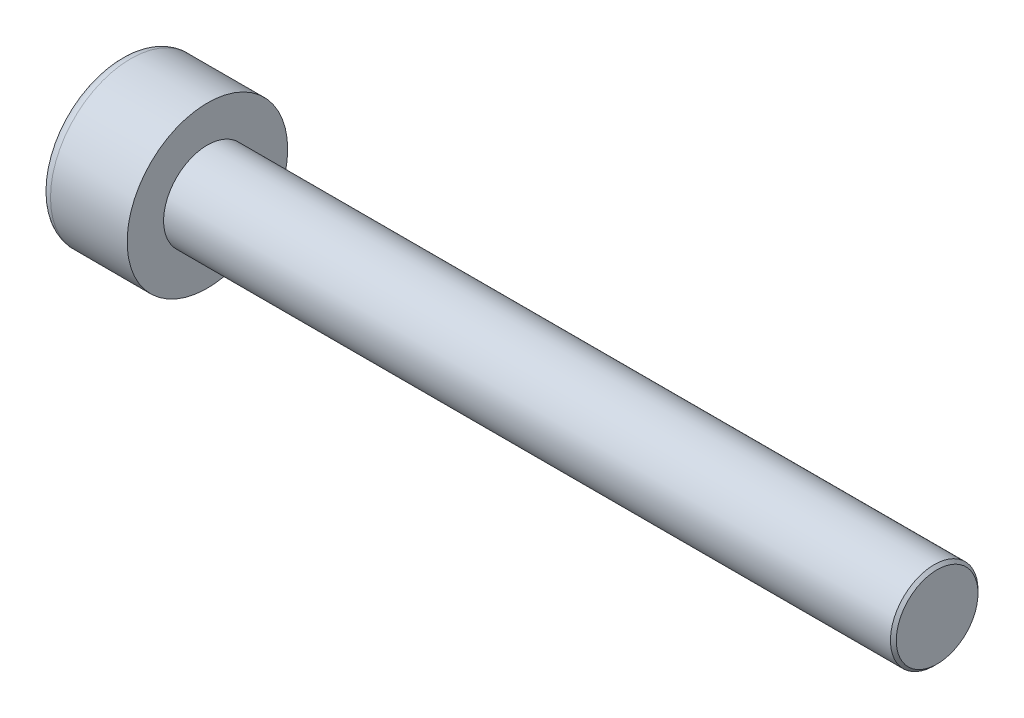
ISO-10303-21;
HEADER;
FILE_DESCRIPTION(('STEP AP214'),'2;1');
FILE_NAME('part.step','',(''),(''),'','','');
FILE_SCHEMA(('AUTOMOTIVE_DESIGN { 1 0 10303 214 1 1 1 1 }'));
ENDSEC;
DATA;
#1=APPLICATION_CONTEXT('core data for automotive mechanical design processes');
#2=APPLICATION_PROTOCOL_DEFINITION('international standard','automotive_design',2000,#1);
#3=PRODUCT_CONTEXT('',#1,'mechanical');
#4=PRODUCT('Part','Part','',(#3));
#5=PRODUCT_RELATED_PRODUCT_CATEGORY('part','',(#4));
#6=PRODUCT_DEFINITION_FORMATION('','',#4);
#7=PRODUCT_DEFINITION_CONTEXT('part definition',#1,'design');
#8=PRODUCT_DEFINITION('design','',#6,#7);
#9=PRODUCT_DEFINITION_SHAPE('','',#8);
#10=(LENGTH_UNIT() NAMED_UNIT(*) SI_UNIT(.MILLI.,.METRE.));
#11=(NAMED_UNIT(*) PLANE_ANGLE_UNIT() SI_UNIT($,.RADIAN.));
#12=(NAMED_UNIT(*) SI_UNIT($,.STERADIAN.) SOLID_ANGLE_UNIT());
#13=UNCERTAINTY_MEASURE_WITH_UNIT(LENGTH_MEASURE(1.E-05),#10,'distance_accuracy_value','');
#14=(GEOMETRIC_REPRESENTATION_CONTEXT(3) GLOBAL_UNCERTAINTY_ASSIGNED_CONTEXT((#13)) GLOBAL_UNIT_ASSIGNED_CONTEXT((#10,
#11,#12)) REPRESENTATION_CONTEXT('',''));
#15=CARTESIAN_POINT('',(0.,0.,0.));
#16=DIRECTION('',(0.,0.,1.));
#17=DIRECTION('',(1.,0.,0.));
#18=AXIS2_PLACEMENT_3D('',#15,#16,#17);
#19=CARTESIAN_POINT('',(1.3,-1.25,0.721687836487031));
#20=DIRECTION('',(0.,1.,0.));
#21=DIRECTION('',(1.,0.,0.));
#22=AXIS2_PLACEMENT_3D('',#19,#20,#21);
#23=PLANE('',#22);
#24=DIRECTION('',(0.,0.,-1.));
#25=VECTOR('',#24,1.);
#26=CARTESIAN_POINT('',(0.,-1.25,0.721687836487031));
#27=LINE('',#26,#25);
#28=CARTESIAN_POINT('',(0.,-1.25,0.721687836487031));
#29=VERTEX_POINT('',#28);
#30=CARTESIAN_POINT('',(0.,-1.25,-0.721687836487035));
#31=VERTEX_POINT('',#30);
#32=EDGE_CURVE('E280',#29,#31,#27,.T.);
#33=ORIENTED_EDGE('',*,*,#32,.F.);
#34=DIRECTION('',(-1.,0.,0.));
#35=VECTOR('',#34,1.);
#36=CARTESIAN_POINT('',(1.3,-1.25,0.721687836487031));
#37=LINE('',#36,#35);
#38=CARTESIAN_POINT('',(1.3,-1.25,0.721687836487031));
#39=VERTEX_POINT('',#38);
#40=EDGE_CURVE('E11',#39,#29,#37,.T.);
#41=ORIENTED_EDGE('',*,*,#40,.F.);
#42=DIRECTION('',(0.,0.,-1.));
#43=VECTOR('',#42,1.);
#44=CARTESIAN_POINT('',(1.3,-1.25,0.721687836487031));
#45=LINE('',#44,#43);
#46=CARTESIAN_POINT('',(1.3,-1.25,0.));
#47=VERTEX_POINT('',#46);
#48=EDGE_CURVE('E202',#39,#47,#45,.T.);
#49=ORIENTED_EDGE('',*,*,#48,.T.);
#50=DIRECTION('',(0.,0.,-1.));
#51=VECTOR('',#50,1.);
#52=CARTESIAN_POINT('',(1.3,-1.25,0.721687836487031));
#53=LINE('',#52,#51);
#54=CARTESIAN_POINT('',(1.3,-1.25,-0.721687836487035));
#55=VERTEX_POINT('',#54);
#56=EDGE_CURVE('E164',#47,#55,#53,.T.);
#57=ORIENTED_EDGE('',*,*,#56,.T.);
#58=DIRECTION('',(-1.,0.,0.));
#59=VECTOR('',#58,1.);
#60=CARTESIAN_POINT('',(1.3,-1.25,-0.721687836487035));
#61=LINE('',#60,#59);
#62=EDGE_CURVE('E160',#55,#31,#61,.T.);
#63=ORIENTED_EDGE('',*,*,#62,.T.);
#64=EDGE_LOOP('',(#33,#41,#49,#57,#63));
#65=FACE_BOUND('',#64,.T.);
#66=ADVANCED_FACE('F17',(#65),#23,.T.);
#67=CARTESIAN_POINT('',(1.3,0.,1.44337567297406));
#68=DIRECTION('',(0.,0.5,-0.866025403784439));
#69=DIRECTION('',(-1.,0.,0.));
#70=AXIS2_PLACEMENT_3D('',#67,#68,#69);
#71=PLANE('',#70);
#72=DIRECTION('',(0.,-0.866025403784439,-0.5));
#73=VECTOR('',#72,1.);
#74=CARTESIAN_POINT('',(0.,0.,1.44337567297406));
#75=LINE('',#74,#73);
#76=CARTESIAN_POINT('',(0.,0.,1.44337567297406));
#77=VERTEX_POINT('',#76);
#78=EDGE_CURVE('E272',#77,#29,#75,.T.);
#79=ORIENTED_EDGE('',*,*,#78,.F.);
#80=DIRECTION('',(-1.,0.,0.));
#81=VECTOR('',#80,1.);
#82=CARTESIAN_POINT('',(1.3,0.,1.44337567297406));
#83=LINE('',#82,#81);
#84=CARTESIAN_POINT('',(1.3,0.,1.44337567297406));
#85=VERTEX_POINT('',#84);
#86=EDGE_CURVE('E28',#85,#77,#83,.T.);
#87=ORIENTED_EDGE('',*,*,#86,.F.);
#88=DIRECTION('',(0.,-0.866025403784439,-0.5));
#89=VECTOR('',#88,1.);
#90=CARTESIAN_POINT('',(1.3,0.,1.44337567297406));
#91=LINE('',#90,#89);
#92=CARTESIAN_POINT('',(1.3,-0.625,1.08253175473055));
#93=VERTEX_POINT('',#92);
#94=EDGE_CURVE('E193',#85,#93,#91,.T.);
#95=ORIENTED_EDGE('',*,*,#94,.T.);
#96=DIRECTION('',(0.,-0.866025403784439,-0.5));
#97=VECTOR('',#96,1.);
#98=CARTESIAN_POINT('',(1.3,0.,1.44337567297406));
#99=LINE('',#98,#97);
#100=EDGE_CURVE('E205',#93,#39,#99,.T.);
#101=ORIENTED_EDGE('',*,*,#100,.T.);
#102=ORIENTED_EDGE('',*,*,#40,.T.);
#103=EDGE_LOOP('',(#79,#87,#95,#101,#102));
#104=FACE_BOUND('',#103,.T.);
#105=ADVANCED_FACE('F345',(#104),#71,.T.);
#106=CARTESIAN_POINT('',(1.3,1.25,0.721687836487032));
#107=DIRECTION('',(0.,-0.5,-0.866025403784439));
#108=DIRECTION('',(0.,-0.866025403784439,0.5));
#109=AXIS2_PLACEMENT_3D('',#106,#107,#108);
#110=PLANE('',#109);
#111=DIRECTION('',(0.,-0.866025403784439,0.5));
#112=VECTOR('',#111,1.);
#113=CARTESIAN_POINT('',(0.,1.25,0.721687836487032));
#114=LINE('',#113,#112);
#115=CARTESIAN_POINT('',(0.,1.25,0.721687836487032));
#116=VERTEX_POINT('',#115);
#117=EDGE_CURVE('E268',#116,#77,#114,.T.);
#118=ORIENTED_EDGE('',*,*,#117,.F.);
#119=DIRECTION('',(-1.,0.,0.));
#120=VECTOR('',#119,1.);
#121=CARTESIAN_POINT('',(1.3,1.25,0.721687836487032));
#122=LINE('',#121,#120);
#123=CARTESIAN_POINT('',(1.3,1.25,0.721687836487032));
#124=VERTEX_POINT('',#123);
#125=EDGE_CURVE('E198',#124,#116,#122,.T.);
#126=ORIENTED_EDGE('',*,*,#125,.F.);
#127=DIRECTION('',(0.,-0.866025403784439,0.5));
#128=VECTOR('',#127,1.);
#129=CARTESIAN_POINT('',(1.3,1.25,0.721687836487032));
#130=LINE('',#129,#128);
#131=CARTESIAN_POINT('',(1.3,0.625,1.08253175473055));
#132=VERTEX_POINT('',#131);
#133=EDGE_CURVE('E239',#124,#132,#130,.T.);
#134=ORIENTED_EDGE('',*,*,#133,.T.);
#135=DIRECTION('',(0.,-0.866025403784439,0.5));
#136=VECTOR('',#135,1.);
#137=CARTESIAN_POINT('',(1.3,1.25,0.721687836487032));
#138=LINE('',#137,#136);
#139=EDGE_CURVE('E197',#132,#85,#138,.T.);
#140=ORIENTED_EDGE('',*,*,#139,.T.);
#141=ORIENTED_EDGE('',*,*,#86,.T.);
#142=EDGE_LOOP('',(#118,#126,#134,#140,#141));
#143=FACE_BOUND('',#142,.T.);
#144=ADVANCED_FACE('F343',(#143),#110,.T.);
#145=CARTESIAN_POINT('',(1.3,1.25,-0.721687836487031));
#146=DIRECTION('',(0.,-1.,0.));
#147=DIRECTION('',(0.,0.,-1.));
#148=AXIS2_PLACEMENT_3D('',#145,#146,#147);
#149=PLANE('',#148);
#150=DIRECTION('',(0.,0.,1.));
#151=VECTOR('',#150,1.);
#152=CARTESIAN_POINT('',(0.,1.25,-0.721687836487031));
#153=LINE('',#152,#151);
#154=CARTESIAN_POINT('',(0.,1.25,-0.721687836487031));
#155=VERTEX_POINT('',#154);
#156=EDGE_CURVE('E250',#155,#116,#153,.T.);
#157=ORIENTED_EDGE('',*,*,#156,.F.);
#158=DIRECTION('',(-1.,0.,0.));
#159=VECTOR('',#158,1.);
#160=CARTESIAN_POINT('',(1.3,1.25,-0.721687836487031));
#161=LINE('',#160,#159);
#162=CARTESIAN_POINT('',(1.3,1.25,-0.721687836487031));
#163=VERTEX_POINT('',#162);
#164=EDGE_CURVE('E201',#163,#155,#161,.T.);
#165=ORIENTED_EDGE('',*,*,#164,.F.);
#166=DIRECTION('',(0.,0.,1.));
#167=VECTOR('',#166,1.);
#168=CARTESIAN_POINT('',(1.3,1.25,-0.721687836487031));
#169=LINE('',#168,#167);
#170=CARTESIAN_POINT('',(1.3,1.25,0.));
#171=VERTEX_POINT('',#170);
#172=EDGE_CURVE('E192',#163,#171,#169,.T.);
#173=ORIENTED_EDGE('',*,*,#172,.T.);
#174=DIRECTION('',(0.,0.,1.));
#175=VECTOR('',#174,1.);
#176=CARTESIAN_POINT('',(1.3,1.25,-0.721687836487031));
#177=LINE('',#176,#175);
#178=EDGE_CURVE('E242',#171,#124,#177,.T.);
#179=ORIENTED_EDGE('',*,*,#178,.T.);
#180=ORIENTED_EDGE('',*,*,#125,.T.);
#181=EDGE_LOOP('',(#157,#165,#173,#179,#180));
#182=FACE_BOUND('',#181,.T.);
#183=ADVANCED_FACE('F318',(#182),#149,.T.);
#184=CARTESIAN_POINT('',(1.3,0.,-1.44337567297406));
#185=DIRECTION('',(0.,-0.5,0.866025403784439));
#186=DIRECTION('',(-1.,0.,0.));
#187=AXIS2_PLACEMENT_3D('',#184,#185,#186);
#188=PLANE('',#187);
#189=DIRECTION('',(0.,0.866025403784439,0.5));
#190=VECTOR('',#189,1.);
#191=CARTESIAN_POINT('',(0.,0.,-1.44337567297406));
#192=LINE('',#191,#190);
#193=CARTESIAN_POINT('',(0.,0.,-1.44337567297406));
#194=VERTEX_POINT('',#193);
#195=EDGE_CURVE('E246',#194,#155,#192,.T.);
#196=ORIENTED_EDGE('',*,*,#195,.F.);
#197=DIRECTION('',(-1.,0.,0.));
#198=VECTOR('',#197,1.);
#199=CARTESIAN_POINT('',(1.3,0.,-1.44337567297406));
#200=LINE('',#199,#198);
#201=CARTESIAN_POINT('',(1.3,0.,-1.44337567297406));
#202=VERTEX_POINT('',#201);
#203=EDGE_CURVE('E326',#202,#194,#200,.T.);
#204=ORIENTED_EDGE('',*,*,#203,.F.);
#205=DIRECTION('',(0.,0.866025403784439,0.5));
#206=VECTOR('',#205,1.);
#207=CARTESIAN_POINT('',(1.3,0.,-1.44337567297406));
#208=LINE('',#207,#206);
#209=CARTESIAN_POINT('',(1.3,0.625,-1.08253175473055));
#210=VERTEX_POINT('',#209);
#211=EDGE_CURVE('E151',#202,#210,#208,.T.);
#212=ORIENTED_EDGE('',*,*,#211,.T.);
#213=DIRECTION('',(0.,0.866025403784439,0.5));
#214=VECTOR('',#213,1.);
#215=CARTESIAN_POINT('',(1.3,0.,-1.44337567297406));
#216=LINE('',#215,#214);
#217=EDGE_CURVE('E189',#210,#163,#216,.T.);
#218=ORIENTED_EDGE('',*,*,#217,.T.);
#219=ORIENTED_EDGE('',*,*,#164,.T.);
#220=EDGE_LOOP('',(#196,#204,#212,#218,#219));
#221=FACE_BOUND('',#220,.T.);
#222=ADVANCED_FACE('F351',(#221),#188,.T.);
#223=CARTESIAN_POINT('',(1.3,-1.25,-0.721687836487035));
#224=DIRECTION('',(0.,0.5,0.866025403784439));
#225=DIRECTION('',(1.,0.,0.));
#226=AXIS2_PLACEMENT_3D('',#223,#224,#225);
#227=PLANE('',#226);
#228=DIRECTION('',(0.,0.866025403784439,-0.5));
#229=VECTOR('',#228,1.);
#230=CARTESIAN_POINT('',(0.,-1.25,-0.721687836487035));
#231=LINE('',#230,#229);
#232=EDGE_CURVE('E196',#31,#194,#231,.T.);
#233=ORIENTED_EDGE('',*,*,#232,.F.);
#234=ORIENTED_EDGE('',*,*,#62,.F.);
#235=DIRECTION('',(0.,0.866025403784439,-0.5));
#236=VECTOR('',#235,1.);
#237=CARTESIAN_POINT('',(1.3,-1.25,-0.721687836487035));
#238=LINE('',#237,#236);
#239=CARTESIAN_POINT('',(1.3,-0.625,-1.08253175473055));
#240=VERTEX_POINT('',#239);
#241=EDGE_CURVE('E154',#55,#240,#238,.T.);
#242=ORIENTED_EDGE('',*,*,#241,.T.);
#243=DIRECTION('',(0.,0.866025403784439,-0.5));
#244=VECTOR('',#243,1.);
#245=CARTESIAN_POINT('',(1.3,-1.25,-0.721687836487035));
#246=LINE('',#245,#244);
#247=EDGE_CURVE('E143',#240,#202,#246,.T.);
#248=ORIENTED_EDGE('',*,*,#247,.T.);
#249=ORIENTED_EDGE('',*,*,#203,.T.);
#250=EDGE_LOOP('',(#233,#234,#242,#248,#249));
#251=FACE_BOUND('',#250,.T.);
#252=ADVANCED_FACE('F159',(#251),#227,.T.);
#253=CARTESIAN_POINT('',(28.,0.,0.));
#254=DIRECTION('',(1.,0.,0.));
#255=DIRECTION('',(0.,1.,0.));
#256=AXIS2_PLACEMENT_3D('',#253,#254,#255);
#257=PLANE('',#256);
#258=CARTESIAN_POINT('',(28.,0.,0.));
#259=DIRECTION('',(1.,0.,0.));
#260=DIRECTION('',(0.,0.,-1.));
#261=AXIS2_PLACEMENT_3D('',#258,#259,#260);
#262=CIRCLE('',#261,1.4);
#263=CARTESIAN_POINT('',(28.,0.,-1.4));
#264=VERTEX_POINT('',#263);
#265=EDGE_CURVE('E215',#264,#264,#262,.T.);
#266=ORIENTED_EDGE('',*,*,#265,.T.);
#267=EDGE_LOOP('',(#266));
#268=FACE_BOUND('',#267,.T.);
#269=ADVANCED_FACE('F359',(#268),#257,.T.);
#270=CARTESIAN_POINT('',(3.,0.,0.));
#271=DIRECTION('',(1.,0.,0.));
#272=DIRECTION('',(0.,1.,0.));
#273=AXIS2_PLACEMENT_3D('',#270,#271,#272);
#274=PLANE('',#273);
#275=CARTESIAN_POINT('',(3.,0.,0.));
#276=DIRECTION('',(1.,0.,0.));
#277=DIRECTION('',(0.,0.,-1.));
#278=AXIS2_PLACEMENT_3D('',#275,#276,#277);
#279=CIRCLE('',#278,1.5);
#280=CARTESIAN_POINT('',(3.,0.,-1.5));
#281=VERTEX_POINT('',#280);
#282=EDGE_CURVE('E251',#281,#281,#279,.T.);
#283=ORIENTED_EDGE('',*,*,#282,.F.);
#284=EDGE_LOOP('',(#283));
#285=FACE_BOUND('',#284,.T.);
#286=CARTESIAN_POINT('',(3.,0.,0.));
#287=DIRECTION('',(1.,0.,0.));
#288=DIRECTION('',(0.,0.,-1.));
#289=AXIS2_PLACEMENT_3D('',#286,#287,#288);
#290=CIRCLE('',#289,2.75);
#291=CARTESIAN_POINT('',(3.,0.,-2.75));
#292=VERTEX_POINT('',#291);
#293=EDGE_CURVE('E209',#292,#292,#290,.T.);
#294=ORIENTED_EDGE('',*,*,#293,.T.);
#295=EDGE_LOOP('',(#294));
#296=FACE_BOUND('',#295,.T.);
#297=ADVANCED_FACE('F384',(#285,#296),#274,.T.);
#298=CARTESIAN_POINT('',(0.,0.,0.));
#299=DIRECTION('',(1.,0.,0.));
#300=DIRECTION('',(0.,1.,0.));
#301=AXIS2_PLACEMENT_3D('',#298,#299,#300);
#302=PLANE('',#301);
#303=ORIENTED_EDGE('',*,*,#232,.T.);
#304=ORIENTED_EDGE('',*,*,#195,.T.);
#305=ORIENTED_EDGE('',*,*,#156,.T.);
#306=ORIENTED_EDGE('',*,*,#117,.T.);
#307=ORIENTED_EDGE('',*,*,#78,.T.);
#308=ORIENTED_EDGE('',*,*,#32,.T.);
#309=EDGE_LOOP('',(#303,#304,#305,#306,#307,#308));
#310=FACE_BOUND('',#309,.T.);
#311=CARTESIAN_POINT('',(0.,0.,0.));
#312=DIRECTION('',(-1.,0.,0.));
#313=DIRECTION('',(0.,0.,-1.));
#314=AXIS2_PLACEMENT_3D('',#311,#312,#313);
#315=CIRCLE('',#314,2.375);
#316=CARTESIAN_POINT('',(0.,0.,2.375));
#317=VERTEX_POINT('',#316);
#318=EDGE_CURVE('E184',#317,#317,#315,.T.);
#319=ORIENTED_EDGE('',*,*,#318,.T.);
#320=EDGE_LOOP('',(#319));
#321=FACE_BOUND('',#320,.T.);
#322=ADVANCED_FACE('F349',(#310,#321),#302,.F.);
#323=CARTESIAN_POINT('',(1.3,-2.5,0.));
#324=DIRECTION('',(-1.,0.,0.));
#325=DIRECTION('',(0.,0.,1.));
#326=AXIS2_PLACEMENT_3D('',#323,#324,#325);
#327=PLANE('',#326);
#328=ORIENTED_EDGE('',*,*,#139,.F.);
#329=CARTESIAN_POINT('',(1.3,0.,0.));
#330=DIRECTION('',(1.,0.,0.));
#331=DIRECTION('',(0.,0.,1.));
#332=AXIS2_PLACEMENT_3D('',#329,#330,#331);
#333=CIRCLE('',#332,1.25);
#334=EDGE_CURVE('E260',#132,#93,#333,.T.);
#335=ORIENTED_EDGE('',*,*,#334,.T.);
#336=ORIENTED_EDGE('',*,*,#94,.F.);
#337=EDGE_LOOP('',(#328,#335,#336));
#338=FACE_BOUND('',#337,.T.);
#339=ADVANCED_FACE('F344',(#338),#327,.T.);
#340=CARTESIAN_POINT('',(1.3,-2.5,0.));
#341=DIRECTION('',(-1.,0.,0.));
#342=DIRECTION('',(0.,0.,1.));
#343=AXIS2_PLACEMENT_3D('',#340,#341,#342);
#344=PLANE('',#343);
#345=ORIENTED_EDGE('',*,*,#178,.F.);
#346=CARTESIAN_POINT('',(1.3,0.,0.));
#347=DIRECTION('',(1.,0.,0.));
#348=DIRECTION('',(0.,0.,1.));
#349=AXIS2_PLACEMENT_3D('',#346,#347,#348);
#350=CIRCLE('',#349,1.25);
#351=EDGE_CURVE('E256',#171,#132,#350,.T.);
#352=ORIENTED_EDGE('',*,*,#351,.T.);
#353=ORIENTED_EDGE('',*,*,#133,.F.);
#354=EDGE_LOOP('',(#345,#352,#353));
#355=FACE_BOUND('',#354,.T.);
#356=ADVANCED_FACE('F312',(#355),#344,.T.);
#357=CARTESIAN_POINT('',(1.3,-2.5,0.));
#358=DIRECTION('',(-1.,0.,0.));
#359=DIRECTION('',(0.,0.,1.));
#360=AXIS2_PLACEMENT_3D('',#357,#358,#359);
#361=PLANE('',#360);
#362=ORIENTED_EDGE('',*,*,#217,.F.);
#363=CARTESIAN_POINT('',(1.3,0.,0.));
#364=DIRECTION('',(1.,0.,0.));
#365=DIRECTION('',(0.,0.,-1.));
#366=AXIS2_PLACEMENT_3D('',#363,#364,#365);
#367=CIRCLE('',#366,1.25);
#368=EDGE_CURVE('E21',#210,#171,#367,.T.);
#369=ORIENTED_EDGE('',*,*,#368,.T.);
#370=ORIENTED_EDGE('',*,*,#172,.F.);
#371=EDGE_LOOP('',(#362,#369,#370));
#372=FACE_BOUND('',#371,.T.);
#373=ADVANCED_FACE('F308',(#372),#361,.T.);
#374=CARTESIAN_POINT('',(1.3,-2.5,0.));
#375=DIRECTION('',(-1.,0.,0.));
#376=DIRECTION('',(0.,0.,1.));
#377=AXIS2_PLACEMENT_3D('',#374,#375,#376);
#378=PLANE('',#377);
#379=ORIENTED_EDGE('',*,*,#247,.F.);
#380=CARTESIAN_POINT('',(1.3,0.,0.));
#381=DIRECTION('',(1.,0.,0.));
#382=DIRECTION('',(0.,0.,1.));
#383=AXIS2_PLACEMENT_3D('',#380,#381,#382);
#384=CIRCLE('',#383,1.25);
#385=CARTESIAN_POINT('',(1.3,0.,-1.25));
#386=VERTEX_POINT('',#385);
#387=EDGE_CURVE('E148',#240,#386,#384,.T.);
#388=ORIENTED_EDGE('',*,*,#387,.T.);
#389=CARTESIAN_POINT('',(1.3,0.,0.));
#390=DIRECTION('',(1.,0.,0.));
#391=DIRECTION('',(0.,0.,1.));
#392=AXIS2_PLACEMENT_3D('',#389,#390,#391);
#393=CIRCLE('',#392,1.25);
#394=EDGE_CURVE('E254',#386,#210,#393,.T.);
#395=ORIENTED_EDGE('',*,*,#394,.T.);
#396=ORIENTED_EDGE('',*,*,#211,.F.);
#397=EDGE_LOOP('',(#379,#388,#395,#396));
#398=FACE_BOUND('',#397,.T.);
#399=ADVANCED_FACE('F145',(#398),#378,.T.);
#400=CARTESIAN_POINT('',(1.3,-2.5,0.));
#401=DIRECTION('',(-1.,0.,0.));
#402=DIRECTION('',(0.,0.,1.));
#403=AXIS2_PLACEMENT_3D('',#400,#401,#402);
#404=PLANE('',#403);
#405=ORIENTED_EDGE('',*,*,#56,.F.);
#406=CARTESIAN_POINT('',(1.3,0.,0.));
#407=DIRECTION('',(1.,0.,0.));
#408=DIRECTION('',(0.,0.,1.));
#409=AXIS2_PLACEMENT_3D('',#406,#407,#408);
#410=CIRCLE('',#409,1.25);
#411=EDGE_CURVE('E167',#47,#240,#410,.T.);
#412=ORIENTED_EDGE('',*,*,#411,.T.);
#413=ORIENTED_EDGE('',*,*,#241,.F.);
#414=EDGE_LOOP('',(#405,#412,#413));
#415=FACE_BOUND('',#414,.T.);
#416=ADVANCED_FACE('F168',(#415),#404,.T.);
#417=CARTESIAN_POINT('',(1.3,-2.5,0.));
#418=DIRECTION('',(-1.,0.,0.));
#419=DIRECTION('',(0.,0.,1.));
#420=AXIS2_PLACEMENT_3D('',#417,#418,#419);
#421=PLANE('',#420);
#422=ORIENTED_EDGE('',*,*,#100,.F.);
#423=CARTESIAN_POINT('',(1.3,0.,0.));
#424=DIRECTION('',(1.,0.,0.));
#425=DIRECTION('',(0.,0.,1.));
#426=AXIS2_PLACEMENT_3D('',#423,#424,#425);
#427=CIRCLE('',#426,1.25);
#428=EDGE_CURVE('E173',#93,#47,#427,.T.);
#429=ORIENTED_EDGE('',*,*,#428,.T.);
#430=ORIENTED_EDGE('',*,*,#48,.F.);
#431=EDGE_LOOP('',(#422,#429,#430));
#432=FACE_BOUND('',#431,.T.);
#433=ADVANCED_FACE('F346',(#432),#421,.T.);
#434=CARTESIAN_POINT('',(3.,0.,0.));
#435=DIRECTION('',(-1.,0.,0.));
#436=DIRECTION('',(0.,0.,1.));
#437=AXIS2_PLACEMENT_3D('',#434,#435,#436);
#438=CYLINDRICAL_SURFACE('',#437,2.75);
#439=CARTESIAN_POINT('',(0.375,0.,0.));
#440=DIRECTION('',(1.,0.,0.));
#441=DIRECTION('',(0.,0.,-1.));
#442=AXIS2_PLACEMENT_3D('',#439,#440,#441);
#443=CIRCLE('',#442,2.75);
#444=CARTESIAN_POINT('',(0.375,0.,-2.75));
#445=VERTEX_POINT('',#444);
#446=CARTESIAN_POINT('',(0.375,0.,2.75));
#447=VERTEX_POINT('',#446);
#448=EDGE_CURVE('E211',#445,#447,#443,.T.);
#449=ORIENTED_EDGE('',*,*,#448,.T.);
#450=CARTESIAN_POINT('',(0.375,0.,0.));
#451=DIRECTION('',(1.,0.,0.));
#452=DIRECTION('',(0.,0.,-1.));
#453=AXIS2_PLACEMENT_3D('',#450,#451,#452);
#454=CIRCLE('',#453,2.75);
#455=EDGE_CURVE('E214',#447,#445,#454,.T.);
#456=ORIENTED_EDGE('',*,*,#455,.T.);
#457=DIRECTION('',(1.,0.,0.));
#458=VECTOR('',#457,1.);
#459=CARTESIAN_POINT('',(3.,0.,-2.75));
#460=LINE('',#459,#458);
#461=EDGE_CURVE('E206',#445,#292,#460,.T.);
#462=ORIENTED_EDGE('',*,*,#461,.T.);
#463=ORIENTED_EDGE('',*,*,#293,.F.);
#464=ORIENTED_EDGE('',*,*,#461,.F.);
#465=EDGE_LOOP('',(#449,#456,#462,#463,#464));
#466=FACE_BOUND('',#465,.T.);
#467=ADVANCED_FACE('F395',(#466),#438,.T.);
#468=CARTESIAN_POINT('',(11.,0.,0.));
#469=DIRECTION('',(-1.,0.,0.));
#470=DIRECTION('',(0.,0.,1.));
#471=AXIS2_PLACEMENT_3D('',#468,#469,#470);
#472=CYLINDRICAL_SURFACE('',#471,1.5);
#473=ORIENTED_EDGE('',*,*,#282,.T.);
#474=DIRECTION('',(1.,0.,0.));
#475=VECTOR('',#474,1.);
#476=CARTESIAN_POINT('',(11.,0.,-1.5));
#477=LINE('',#476,#475);
#478=CARTESIAN_POINT('',(27.9,0.,-1.5));
#479=VERTEX_POINT('',#478);
#480=EDGE_CURVE('E210',#281,#479,#477,.T.);
#481=ORIENTED_EDGE('',*,*,#480,.T.);
#482=CARTESIAN_POINT('',(27.9,0.,0.));
#483=DIRECTION('',(-1.,0.,0.));
#484=DIRECTION('',(0.,0.,-1.));
#485=AXIS2_PLACEMENT_3D('',#482,#483,#484);
#486=CIRCLE('',#485,1.5);
#487=EDGE_CURVE('E234',#479,#479,#486,.T.);
#488=ORIENTED_EDGE('',*,*,#487,.T.);
#489=ORIENTED_EDGE('',*,*,#480,.F.);
#490=EDGE_LOOP('',(#473,#481,#488,#489));
#491=FACE_BOUND('',#490,.T.);
#492=ADVANCED_FACE('F392',(#491),#472,.T.);
#493=CARTESIAN_POINT('',(1.3,0.,0.));
#494=DIRECTION('',(-1.,0.,0.));
#495=DIRECTION('',(0.,0.,1.));
#496=AXIS2_PLACEMENT_3D('',#493,#494,#495);
#497=CONICAL_SURFACE('',#496,1.25,1.0471975511966);
#498=DIRECTION('',(-0.5,0.,-0.866025403784438));
#499=VECTOR('',#498,1.);
#500=CARTESIAN_POINT('',(1.3,0.,-1.25));
#501=LINE('',#500,#499);
#502=CARTESIAN_POINT('',(2.02168783648704,0.,0.));
#503=VERTEX_POINT('',#502);
#504=EDGE_CURVE('E177',#503,#386,#501,.T.);
#505=ORIENTED_EDGE('',*,*,#504,.T.);
#506=ORIENTED_EDGE('',*,*,#387,.F.);
#507=ORIENTED_EDGE('',*,*,#411,.F.);
#508=ORIENTED_EDGE('',*,*,#428,.F.);
#509=ORIENTED_EDGE('',*,*,#334,.F.);
#510=ORIENTED_EDGE('',*,*,#351,.F.);
#511=ORIENTED_EDGE('',*,*,#368,.F.);
#512=ORIENTED_EDGE('',*,*,#394,.F.);
#513=ORIENTED_EDGE('',*,*,#504,.F.);
#514=EDGE_LOOP('',(#505,#506,#507,#508,#509,#510,#511,#512,#513));
#515=FACE_BOUND('',#514,.T.);
#516=ADVANCED_FACE('F175',(#515),#497,.F.);
#517=CARTESIAN_POINT('',(0.375,0.,0.));
#518=DIRECTION('',(1.,0.,0.));
#519=DIRECTION('',(0.,0.,-1.));
#520=AXIS2_PLACEMENT_3D('',#517,#518,#519);
#521=TOROIDAL_SURFACE('',#520,2.375,0.375);
#522=ORIENTED_EDGE('',*,*,#448,.F.);
#523=ORIENTED_EDGE('',*,*,#455,.F.);
#524=CARTESIAN_POINT('',(0.375,0.,2.375));
#525=DIRECTION('',(0.,-1.,0.));
#526=DIRECTION('',(0.,0.,1.));
#527=AXIS2_PLACEMENT_3D('',#524,#525,#526);
#528=CIRCLE('',#527,0.375);
#529=EDGE_CURVE('E222',#447,#317,#528,.T.);
#530=ORIENTED_EDGE('',*,*,#529,.T.);
#531=ORIENTED_EDGE('',*,*,#318,.F.);
#532=ORIENTED_EDGE('',*,*,#529,.F.);
#533=EDGE_LOOP('',(#522,#523,#530,#531,#532));
#534=FACE_BOUND('',#533,.T.);
#535=ADVANCED_FACE('F19',(#534),#521,.T.);
#536=CARTESIAN_POINT('',(28.,0.,0.));
#537=DIRECTION('',(-1.,0.,0.));
#538=DIRECTION('',(0.,0.,1.));
#539=AXIS2_PLACEMENT_3D('',#536,#537,#538);
#540=CONICAL_SURFACE('',#539,1.4,0.785398163397452);
#541=ORIENTED_EDGE('',*,*,#487,.F.);
#542=DIRECTION('',(0.707106781186545,0.,0.70710678118655));
#543=VECTOR('',#542,1.);
#544=CARTESIAN_POINT('',(28.,0.,-1.4));
#545=LINE('',#544,#543);
#546=EDGE_CURVE('E225',#479,#264,#545,.T.);
#547=ORIENTED_EDGE('',*,*,#546,.T.);
#548=ORIENTED_EDGE('',*,*,#265,.F.);
#549=ORIENTED_EDGE('',*,*,#546,.F.);
#550=EDGE_LOOP('',(#541,#547,#548,#549));
#551=FACE_BOUND('',#550,.T.);
#552=ADVANCED_FACE('F388',(#551),#540,.T.);
#553=CLOSED_SHELL('',(#66,#105,#144,#183,#222,#252,#269,#297,#322,#339,#356,#373,#399,#416,#433,
#467,#492,#516,#535,#552));
#554=MANIFOLD_SOLID_BREP('B1',#553);
#555=ADVANCED_BREP_SHAPE_REPRESENTATION('',(#18,#554),#14);
#556=SHAPE_DEFINITION_REPRESENTATION(#9,#555);
ENDSEC;
END-ISO-10303-21;
